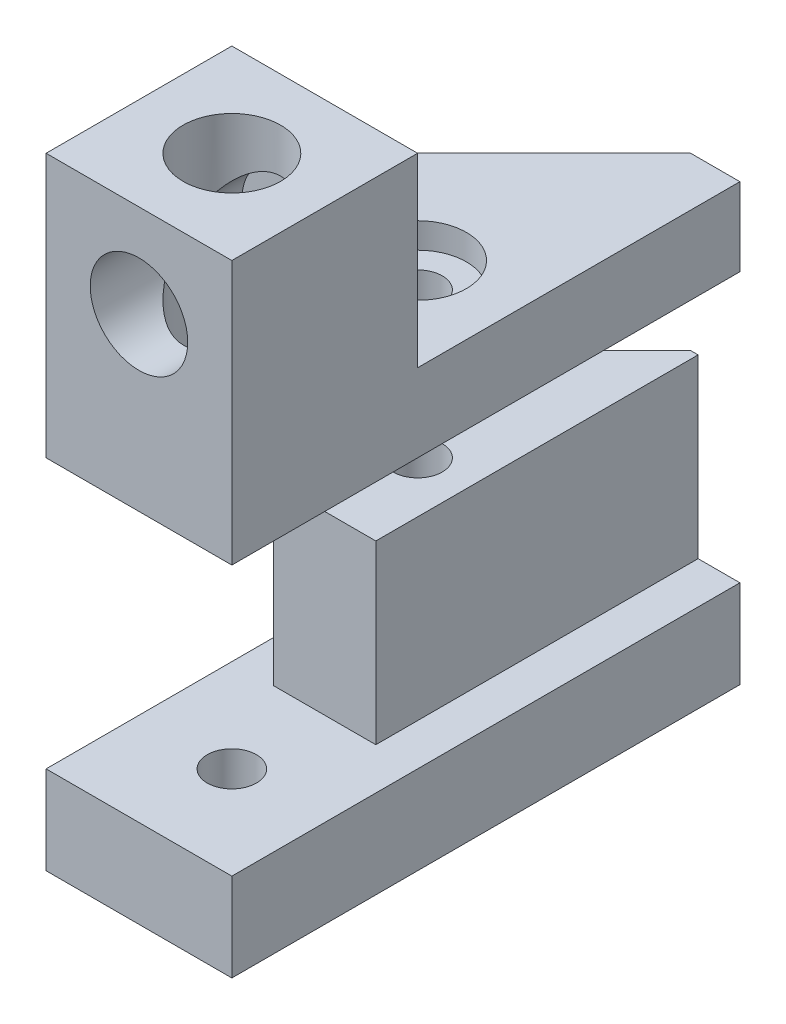
ISO-10303-21;
HEADER;
FILE_DESCRIPTION(('STEP AP214'),'2;1');
FILE_NAME('part.step','',(''),(''),'','','');
FILE_SCHEMA(('AUTOMOTIVE_DESIGN { 1 0 10303 214 1 1 1 1 }'));
ENDSEC;
DATA;
#1=APPLICATION_CONTEXT('core data for automotive mechanical design processes');
#2=APPLICATION_PROTOCOL_DEFINITION('international standard','automotive_design',2000,#1);
#3=PRODUCT_CONTEXT('',#1,'mechanical');
#4=PRODUCT('Part','Part','',(#3));
#5=PRODUCT_RELATED_PRODUCT_CATEGORY('part','',(#4));
#6=PRODUCT_DEFINITION_FORMATION('','',#4);
#7=PRODUCT_DEFINITION_CONTEXT('part definition',#1,'design');
#8=PRODUCT_DEFINITION('design','',#6,#7);
#9=PRODUCT_DEFINITION_SHAPE('','',#8);
#10=(LENGTH_UNIT() NAMED_UNIT(*) SI_UNIT(.MILLI.,.METRE.));
#11=(NAMED_UNIT(*) PLANE_ANGLE_UNIT() SI_UNIT($,.RADIAN.));
#12=(NAMED_UNIT(*) SI_UNIT($,.STERADIAN.) SOLID_ANGLE_UNIT());
#13=UNCERTAINTY_MEASURE_WITH_UNIT(LENGTH_MEASURE(1.E-05),#10,'distance_accuracy_value','');
#14=(GEOMETRIC_REPRESENTATION_CONTEXT(3) GLOBAL_UNCERTAINTY_ASSIGNED_CONTEXT((#13)) GLOBAL_UNIT_ASSIGNED_CONTEXT((#10,
#11,#12)) REPRESENTATION_CONTEXT('',''));
#15=CARTESIAN_POINT('',(0.,0.,0.));
#16=DIRECTION('',(0.,0.,1.));
#17=DIRECTION('',(1.,0.,0.));
#18=AXIS2_PLACEMENT_3D('',#15,#16,#17);
#19=CARTESIAN_POINT('',(0.,46.9,0.));
#20=DIRECTION('',(0.,1.,0.));
#21=DIRECTION('',(0.,0.,1.));
#22=AXIS2_PLACEMENT_3D('',#19,#20,#21);
#23=CYLINDRICAL_SURFACE('',#22,5.25);
#24=CARTESIAN_POINT('',(0.,66.9,0.));
#25=DIRECTION('',(0.,1.,0.));
#26=DIRECTION('',(0.,0.,1.));
#27=AXIS2_PLACEMENT_3D('',#24,#25,#26);
#28=CIRCLE('',#27,5.25);
#29=CARTESIAN_POINT('',(0.,66.9,5.25));
#30=VERTEX_POINT('',#29);
#31=EDGE_CURVE('E166',#30,#30,#28,.T.);
#32=ORIENTED_EDGE('',*,*,#31,.T.);
#33=EDGE_LOOP('',(#32));
#34=FACE_BOUND('',#33,.T.);
#35=CARTESIAN_POINT('',(0.,56.9,0.));
#36=DIRECTION('',(0.,0.707106781186547,-0.707106781186547));
#37=DIRECTION('',(0.,0.707106781186547,0.707106781186547));
#38=AXIS2_PLACEMENT_3D('',#35,#36,#37);
#39=ELLIPSE('',#38,7.42462120245875,5.25);
#40=CARTESIAN_POINT('',(5.25,56.9,0.));
#41=VERTEX_POINT('',#40);
#42=CARTESIAN_POINT('',(-5.25,56.9,0.));
#43=VERTEX_POINT('',#42);
#44=EDGE_CURVE('E12',#41,#43,#39,.F.);
#45=ORIENTED_EDGE('',*,*,#44,.T.);
#46=CARTESIAN_POINT('',(0.,56.9,0.));
#47=DIRECTION('',(0.,0.707106781186547,0.707106781186547));
#48=DIRECTION('',(0.,0.707106781186547,-0.707106781186547));
#49=AXIS2_PLACEMENT_3D('',#46,#47,#48);
#50=ELLIPSE('',#49,7.42462120245875,5.25);
#51=EDGE_CURVE('E64',#43,#41,#50,.F.);
#52=ORIENTED_EDGE('',*,*,#51,.T.);
#53=EDGE_LOOP('',(#45,#52));
#54=FACE_BOUND('',#53,.T.);
#55=ADVANCED_FACE('F55',(#34,#54),#23,.F.);
#56=CARTESIAN_POINT('',(-10.,46.9,-30.));
#57=DIRECTION('',(1.,0.,0.));
#58=DIRECTION('',(0.,0.,-1.));
#59=AXIS2_PLACEMENT_3D('',#56,#57,#58);
#60=PLANE('',#59);
#61=DIRECTION('',(0.,0.,1.));
#62=VECTOR('',#61,1.);
#63=CARTESIAN_POINT('',(-10.,38.5,-30.));
#64=LINE('',#63,#62);
#65=CARTESIAN_POINT('',(-10.,38.5,-30.));
#66=VERTEX_POINT('',#65);
#67=CARTESIAN_POINT('',(-10.,38.5,10.));
#68=VERTEX_POINT('',#67);
#69=EDGE_CURVE('E186',#66,#68,#64,.T.);
#70=ORIENTED_EDGE('',*,*,#69,.T.);
#71=DIRECTION('',(0.,-1.,0.));
#72=VECTOR('',#71,1.);
#73=CARTESIAN_POINT('',(-10.,46.9,10.));
#74=LINE('',#73,#72);
#75=CARTESIAN_POINT('',(-10.,66.9,10.));
#76=VERTEX_POINT('',#75);
#77=EDGE_CURVE('E133',#76,#68,#74,.T.);
#78=ORIENTED_EDGE('',*,*,#77,.F.);
#79=DIRECTION('',(0.,0.,1.));
#80=VECTOR('',#79,1.);
#81=CARTESIAN_POINT('',(-10.,66.9,-10.));
#82=LINE('',#81,#80);
#83=CARTESIAN_POINT('',(-10.,66.9,-10.));
#84=VERTEX_POINT('',#83);
#85=EDGE_CURVE('E169',#84,#76,#82,.T.);
#86=ORIENTED_EDGE('',*,*,#85,.F.);
#87=DIRECTION('',(0.,-1.,0.));
#88=VECTOR('',#87,1.);
#89=CARTESIAN_POINT('',(-10.,66.9,-10.));
#90=LINE('',#89,#88);
#91=CARTESIAN_POINT('',(-10.,46.9,-10.));
#92=VERTEX_POINT('',#91);
#93=EDGE_CURVE('E179',#84,#92,#90,.T.);
#94=ORIENTED_EDGE('',*,*,#93,.T.);
#95=DIRECTION('',(0.,0.,1.));
#96=VECTOR('',#95,1.);
#97=CARTESIAN_POINT('',(-10.,46.9,-30.));
#98=LINE('',#97,#96);
#99=CARTESIAN_POINT('',(-10.,46.9,-30.));
#100=VERTEX_POINT('',#99);
#101=EDGE_CURVE('E187',#100,#92,#98,.T.);
#102=ORIENTED_EDGE('',*,*,#101,.F.);
#103=DIRECTION('',(0.,-1.,0.));
#104=VECTOR('',#103,1.);
#105=CARTESIAN_POINT('',(-10.,46.9,-30.));
#106=LINE('',#105,#104);
#107=EDGE_CURVE('E196',#100,#66,#106,.T.);
#108=ORIENTED_EDGE('',*,*,#107,.T.);
#109=EDGE_LOOP('',(#70,#78,#86,#94,#102,#108));
#110=FACE_BOUND('',#109,.T.);
#111=ADVANCED_FACE('F57',(#110),#60,.F.);
#112=CARTESIAN_POINT('',(-10.,46.9,10.));
#113=DIRECTION('',(0.,0.,-1.));
#114=DIRECTION('',(-1.,0.,0.));
#115=AXIS2_PLACEMENT_3D('',#112,#113,#114);
#116=PLANE('',#115);
#117=CARTESIAN_POINT('',(0.,56.9,10.));
#118=DIRECTION('',(0.,0.,1.));
#119=DIRECTION('',(1.,0.,0.));
#120=AXIS2_PLACEMENT_3D('',#117,#118,#119);
#121=CIRCLE('',#120,5.25);
#122=CARTESIAN_POINT('',(5.25,56.9,10.));
#123=VERTEX_POINT('',#122);
#124=EDGE_CURVE('E142',#123,#123,#121,.T.);
#125=ORIENTED_EDGE('',*,*,#124,.F.);
#126=EDGE_LOOP('',(#125));
#127=FACE_BOUND('',#126,.T.);
#128=DIRECTION('',(1.,0.,0.));
#129=VECTOR('',#128,1.);
#130=CARTESIAN_POINT('',(-10.,38.5,10.));
#131=LINE('',#130,#129);
#132=CARTESIAN_POINT('',(10.,38.5,10.));
#133=VERTEX_POINT('',#132);
#134=EDGE_CURVE('E199',#68,#133,#131,.T.);
#135=ORIENTED_EDGE('',*,*,#134,.T.);
#136=DIRECTION('',(0.,-1.,0.));
#137=VECTOR('',#136,1.);
#138=CARTESIAN_POINT('',(10.,46.9,10.));
#139=LINE('',#138,#137);
#140=CARTESIAN_POINT('',(10.,66.9,10.));
#141=VERTEX_POINT('',#140);
#142=EDGE_CURVE('E136',#141,#133,#139,.T.);
#143=ORIENTED_EDGE('',*,*,#142,.F.);
#144=DIRECTION('',(1.,0.,0.));
#145=VECTOR('',#144,1.);
#146=CARTESIAN_POINT('',(-10.,66.9,10.));
#147=LINE('',#146,#145);
#148=EDGE_CURVE('E172',#76,#141,#147,.T.);
#149=ORIENTED_EDGE('',*,*,#148,.F.);
#150=ORIENTED_EDGE('',*,*,#77,.T.);
#151=EDGE_LOOP('',(#135,#143,#149,#150));
#152=FACE_BOUND('',#151,.T.);
#153=ADVANCED_FACE('F222',(#127,#152),#116,.F.);
#154=CARTESIAN_POINT('',(10.,46.9,-44.7));
#155=DIRECTION('',(-1.,0.,0.));
#156=DIRECTION('',(0.,0.,1.));
#157=AXIS2_PLACEMENT_3D('',#154,#155,#156);
#158=PLANE('',#157);
#159=DIRECTION('',(0.,0.,-1.));
#160=VECTOR('',#159,1.);
#161=CARTESIAN_POINT('',(10.,38.5,-44.7));
#162=LINE('',#161,#160);
#163=CARTESIAN_POINT('',(10.,38.5,-44.7));
#164=VERTEX_POINT('',#163);
#165=EDGE_CURVE('E202',#133,#164,#162,.T.);
#166=ORIENTED_EDGE('',*,*,#165,.T.);
#167=DIRECTION('',(0.,-1.,0.));
#168=VECTOR('',#167,1.);
#169=CARTESIAN_POINT('',(10.,46.9,-44.7));
#170=LINE('',#169,#168);
#171=CARTESIAN_POINT('',(10.,46.9,-44.7));
#172=VERTEX_POINT('',#171);
#173=EDGE_CURVE('E212',#172,#164,#170,.T.);
#174=ORIENTED_EDGE('',*,*,#173,.F.);
#175=DIRECTION('',(0.,0.,-1.));
#176=VECTOR('',#175,1.);
#177=CARTESIAN_POINT('',(10.,46.9,-30.));
#178=LINE('',#177,#176);
#179=CARTESIAN_POINT('',(10.,46.9,-10.));
#180=VERTEX_POINT('',#179);
#181=EDGE_CURVE('E189',#180,#172,#178,.T.);
#182=ORIENTED_EDGE('',*,*,#181,.F.);
#183=DIRECTION('',(0.,-1.,0.));
#184=VECTOR('',#183,1.);
#185=CARTESIAN_POINT('',(10.,66.9,-10.));
#186=LINE('',#185,#184);
#187=CARTESIAN_POINT('',(10.,66.9,-10.));
#188=VERTEX_POINT('',#187);
#189=EDGE_CURVE('E183',#188,#180,#186,.T.);
#190=ORIENTED_EDGE('',*,*,#189,.F.);
#191=DIRECTION('',(0.,0.,-1.));
#192=VECTOR('',#191,1.);
#193=CARTESIAN_POINT('',(10.,66.9,-10.));
#194=LINE('',#193,#192);
#195=EDGE_CURVE('E175',#141,#188,#194,.T.);
#196=ORIENTED_EDGE('',*,*,#195,.F.);
#197=ORIENTED_EDGE('',*,*,#142,.T.);
#198=EDGE_LOOP('',(#166,#174,#182,#190,#196,#197));
#199=FACE_BOUND('',#198,.T.);
#200=ADVANCED_FACE('F217',(#199),#158,.F.);
#201=CARTESIAN_POINT('',(4.7,46.9,-44.7));
#202=DIRECTION('',(0.,0.,1.));
#203=DIRECTION('',(1.,0.,0.));
#204=AXIS2_PLACEMENT_3D('',#201,#202,#203);
#205=PLANE('',#204);
#206=DIRECTION('',(-1.,0.,0.));
#207=VECTOR('',#206,1.);
#208=CARTESIAN_POINT('',(4.7,38.5,-44.7));
#209=LINE('',#208,#207);
#210=CARTESIAN_POINT('',(4.7,38.5,-44.7));
#211=VERTEX_POINT('',#210);
#212=EDGE_CURVE('E204',#164,#211,#209,.T.);
#213=ORIENTED_EDGE('',*,*,#212,.T.);
#214=DIRECTION('',(0.,-1.,0.));
#215=VECTOR('',#214,1.);
#216=CARTESIAN_POINT('',(4.7,46.9,-44.7));
#217=LINE('',#216,#215);
#218=CARTESIAN_POINT('',(4.7,46.9,-44.7));
#219=VERTEX_POINT('',#218);
#220=EDGE_CURVE('E209',#219,#211,#217,.T.);
#221=ORIENTED_EDGE('',*,*,#220,.F.);
#222=DIRECTION('',(-1.,0.,0.));
#223=VECTOR('',#222,1.);
#224=CARTESIAN_POINT('',(4.7,46.9,-44.7));
#225=LINE('',#224,#223);
#226=EDGE_CURVE('E192',#172,#219,#225,.T.);
#227=ORIENTED_EDGE('',*,*,#226,.F.);
#228=ORIENTED_EDGE('',*,*,#173,.T.);
#229=EDGE_LOOP('',(#213,#221,#227,#228));
#230=FACE_BOUND('',#229,.T.);
#231=ADVANCED_FACE('F238',(#230),#205,.F.);
#232=CARTESIAN_POINT('',(-10.,46.9,-30.));
#233=DIRECTION('',(0.707106781186547,0.,0.707106781186548));
#234=DIRECTION('',(0.707106781186548,0.,-0.707106781186547));
#235=AXIS2_PLACEMENT_3D('',#232,#233,#234);
#236=PLANE('',#235);
#237=DIRECTION('',(-0.707106781186548,0.,0.707106781186547));
#238=VECTOR('',#237,1.);
#239=CARTESIAN_POINT('',(-10.,38.5,-30.));
#240=LINE('',#239,#238);
#241=EDGE_CURVE('E190',#211,#66,#240,.T.);
#242=ORIENTED_EDGE('',*,*,#241,.T.);
#243=ORIENTED_EDGE('',*,*,#107,.F.);
#244=DIRECTION('',(-0.707106781186548,0.,0.707106781186547));
#245=VECTOR('',#244,1.);
#246=CARTESIAN_POINT('',(-10.,46.9,-30.));
#247=LINE('',#246,#245);
#248=EDGE_CURVE('E194',#219,#100,#247,.T.);
#249=ORIENTED_EDGE('',*,*,#248,.F.);
#250=ORIENTED_EDGE('',*,*,#220,.T.);
#251=EDGE_LOOP('',(#242,#243,#249,#250));
#252=FACE_BOUND('',#251,.T.);
#253=ADVANCED_FACE('F242',(#252),#236,.F.);
#254=CARTESIAN_POINT('',(0.,46.9,0.));
#255=DIRECTION('',(0.,1.,0.));
#256=DIRECTION('',(0.,0.,1.));
#257=AXIS2_PLACEMENT_3D('',#254,#255,#256);
#258=PLANE('',#257);
#259=CARTESIAN_POINT('',(0.,46.9,-20.));
#260=DIRECTION('',(0.,1.,0.));
#261=DIRECTION('',(0.,0.,1.));
#262=AXIS2_PLACEMENT_3D('',#259,#260,#261);
#263=CIRCLE('',#262,5.24999999999999);
#264=CARTESIAN_POINT('',(0.,46.9,-14.75));
#265=VERTEX_POINT('',#264);
#266=EDGE_CURVE('E158',#265,#265,#263,.T.);
#267=ORIENTED_EDGE('',*,*,#266,.F.);
#268=EDGE_LOOP('',(#267));
#269=FACE_BOUND('',#268,.T.);
#270=DIRECTION('',(-1.,0.,0.));
#271=VECTOR('',#270,1.);
#272=CARTESIAN_POINT('',(-10.,46.9,-10.));
#273=LINE('',#272,#271);
#274=EDGE_CURVE('E79',#180,#92,#273,.T.);
#275=ORIENTED_EDGE('',*,*,#274,.F.);
#276=ORIENTED_EDGE('',*,*,#181,.T.);
#277=ORIENTED_EDGE('',*,*,#226,.T.);
#278=ORIENTED_EDGE('',*,*,#248,.T.);
#279=ORIENTED_EDGE('',*,*,#101,.T.);
#280=EDGE_LOOP('',(#275,#276,#277,#278,#279));
#281=FACE_BOUND('',#280,.T.);
#282=ADVANCED_FACE('F243',(#269,#281),#258,.T.);
#283=CARTESIAN_POINT('',(0.,38.5,0.));
#284=DIRECTION('',(0.,1.,0.));
#285=DIRECTION('',(0.,0.,1.));
#286=AXIS2_PLACEMENT_3D('',#283,#284,#285);
#287=PLANE('',#286);
#288=CARTESIAN_POINT('',(0.,38.5,-20.));
#289=DIRECTION('',(0.,1.,0.));
#290=DIRECTION('',(0.,0.,1.));
#291=AXIS2_PLACEMENT_3D('',#288,#289,#290);
#292=CIRCLE('',#291,2.65);
#293=CARTESIAN_POINT('',(0.,38.5,-17.35));
#294=VERTEX_POINT('',#293);
#295=EDGE_CURVE('E144',#294,#294,#292,.T.);
#296=ORIENTED_EDGE('',*,*,#295,.T.);
#297=EDGE_LOOP('',(#296));
#298=FACE_BOUND('',#297,.T.);
#299=CARTESIAN_POINT('',(0.,38.5,0.));
#300=DIRECTION('',(0.,1.,0.));
#301=DIRECTION('',(0.,0.,1.));
#302=AXIS2_PLACEMENT_3D('',#299,#300,#301);
#303=CIRCLE('',#302,2.65);
#304=CARTESIAN_POINT('',(0.,38.5,2.65));
#305=VERTEX_POINT('',#304);
#306=EDGE_CURVE('E140',#305,#305,#303,.T.);
#307=ORIENTED_EDGE('',*,*,#306,.T.);
#308=EDGE_LOOP('',(#307));
#309=FACE_BOUND('',#308,.T.);
#310=ORIENTED_EDGE('',*,*,#69,.F.);
#311=ORIENTED_EDGE('',*,*,#241,.F.);
#312=ORIENTED_EDGE('',*,*,#212,.F.);
#313=ORIENTED_EDGE('',*,*,#165,.F.);
#314=ORIENTED_EDGE('',*,*,#134,.F.);
#315=EDGE_LOOP('',(#310,#311,#312,#313,#314));
#316=FACE_BOUND('',#315,.T.);
#317=ADVANCED_FACE('F234',(#298,#309,#316),#287,.F.);
#318=CARTESIAN_POINT('',(-10.,66.9,-10.));
#319=DIRECTION('',(0.,0.,1.));
#320=DIRECTION('',(1.,0.,0.));
#321=AXIS2_PLACEMENT_3D('',#318,#319,#320);
#322=PLANE('',#321);
#323=CARTESIAN_POINT('',(0.,56.9,-10.));
#324=DIRECTION('',(0.,0.,1.));
#325=DIRECTION('',(1.,0.,0.));
#326=AXIS2_PLACEMENT_3D('',#323,#324,#325);
#327=CIRCLE('',#326,2.65);
#328=CARTESIAN_POINT('',(2.65,56.9,-10.));
#329=VERTEX_POINT('',#328);
#330=EDGE_CURVE('E59',#329,#329,#327,.T.);
#331=ORIENTED_EDGE('',*,*,#330,.T.);
#332=EDGE_LOOP('',(#331));
#333=FACE_BOUND('',#332,.T.);
#334=ORIENTED_EDGE('',*,*,#274,.T.);
#335=ORIENTED_EDGE('',*,*,#93,.F.);
#336=DIRECTION('',(-1.,0.,0.));
#337=VECTOR('',#336,1.);
#338=CARTESIAN_POINT('',(-10.,66.9,-10.));
#339=LINE('',#338,#337);
#340=EDGE_CURVE('E177',#188,#84,#339,.T.);
#341=ORIENTED_EDGE('',*,*,#340,.F.);
#342=ORIENTED_EDGE('',*,*,#189,.T.);
#343=EDGE_LOOP('',(#334,#335,#341,#342));
#344=FACE_BOUND('',#343,.T.);
#345=ADVANCED_FACE('F245',(#333,#344),#322,.F.);
#346=CARTESIAN_POINT('',(0.,66.9,0.));
#347=DIRECTION('',(0.,1.,0.));
#348=DIRECTION('',(0.,0.,1.));
#349=AXIS2_PLACEMENT_3D('',#346,#347,#348);
#350=PLANE('',#349);
#351=ORIENTED_EDGE('',*,*,#31,.F.);
#352=EDGE_LOOP('',(#351));
#353=FACE_BOUND('',#352,.T.);
#354=ORIENTED_EDGE('',*,*,#85,.T.);
#355=ORIENTED_EDGE('',*,*,#148,.T.);
#356=ORIENTED_EDGE('',*,*,#195,.T.);
#357=ORIENTED_EDGE('',*,*,#340,.T.);
#358=EDGE_LOOP('',(#354,#355,#356,#357));
#359=FACE_BOUND('',#358,.T.);
#360=ADVANCED_FACE('F224',(#353,#359),#350,.T.);
#361=CARTESIAN_POINT('',(0.,56.9,0.));
#362=DIRECTION('',(0.,0.707106781186547,0.707106781186547));
#363=DIRECTION('',(0.,0.707106781186547,-0.707106781186547));
#364=AXIS2_PLACEMENT_3D('',#361,#362,#363);
#365=ELLIPSE('',#364,7.42462120245875,5.25);
#366=EDGE_CURVE('E125',#43,#41,#365,.T.);
#367=ORIENTED_EDGE('',*,*,#366,.T.);
#368=CARTESIAN_POINT('',(0.,56.9,0.));
#369=DIRECTION('',(0.,0.707106781186547,-0.707106781186547));
#370=DIRECTION('',(0.,0.707106781186547,0.707106781186547));
#371=AXIS2_PLACEMENT_3D('',#368,#369,#370);
#372=ELLIPSE('',#371,7.42462120245875,5.25);
#373=EDGE_CURVE('E71',#41,#43,#372,.T.);
#374=ORIENTED_EDGE('',*,*,#373,.T.);
#375=EDGE_LOOP('',(#367,#374));
#376=FACE_BOUND('',#375,.T.);
#377=CARTESIAN_POINT('',(0.,44.15,0.));
#378=DIRECTION('',(0.,1.,0.));
#379=DIRECTION('',(0.,0.,1.));
#380=AXIS2_PLACEMENT_3D('',#377,#378,#379);
#381=CIRCLE('',#380,5.24999999999999);
#382=CARTESIAN_POINT('',(0.,44.15,5.24999999999999));
#383=VERTEX_POINT('',#382);
#384=EDGE_CURVE('E146',#383,#383,#381,.T.);
#385=ORIENTED_EDGE('',*,*,#384,.F.);
#386=EDGE_LOOP('',(#385));
#387=FACE_BOUND('',#386,.T.);
#388=ADVANCED_FACE('F131',(#376,#387),#23,.F.);
#389=CARTESIAN_POINT('',(0.,56.9,-3.6));
#390=DIRECTION('',(0.,0.,1.));
#391=DIRECTION('',(1.,0.,0.));
#392=AXIS2_PLACEMENT_3D('',#389,#390,#391);
#393=CYLINDRICAL_SURFACE('',#392,5.25);
#394=ORIENTED_EDGE('',*,*,#373,.F.);
#395=ORIENTED_EDGE('',*,*,#51,.F.);
#396=EDGE_LOOP('',(#394,#395));
#397=FACE_BOUND('',#396,.T.);
#398=CARTESIAN_POINT('',(0.,56.9,-6.35));
#399=DIRECTION('',(0.,0.,1.));
#400=DIRECTION('',(1.,0.,0.));
#401=AXIS2_PLACEMENT_3D('',#398,#399,#400);
#402=CIRCLE('',#401,5.24999999999999);
#403=CARTESIAN_POINT('',(5.24999999999999,56.9,-6.35));
#404=VERTEX_POINT('',#403);
#405=EDGE_CURVE('E311',#404,#404,#402,.T.);
#406=ORIENTED_EDGE('',*,*,#405,.F.);
#407=EDGE_LOOP('',(#406));
#408=FACE_BOUND('',#407,.T.);
#409=ADVANCED_FACE('F121',(#397,#408),#393,.F.);
#410=ORIENTED_EDGE('',*,*,#124,.T.);
#411=EDGE_LOOP('',(#410));
#412=FACE_BOUND('',#411,.T.);
#413=ORIENTED_EDGE('',*,*,#44,.F.);
#414=ORIENTED_EDGE('',*,*,#366,.F.);
#415=EDGE_LOOP('',(#413,#414));
#416=FACE_BOUND('',#415,.T.);
#417=ADVANCED_FACE('F128',(#412,#416),#393,.F.);
#418=CARTESIAN_POINT('',(0.,46.9,0.));
#419=DIRECTION('',(0.,1.,0.));
#420=DIRECTION('',(0.,0.,1.));
#421=AXIS2_PLACEMENT_3D('',#418,#419,#420);
#422=CYLINDRICAL_SURFACE('',#421,2.65);
#423=CARTESIAN_POINT('',(0.,44.15,0.));
#424=DIRECTION('',(0.,1.,0.));
#425=DIRECTION('',(0.,0.,1.));
#426=AXIS2_PLACEMENT_3D('',#423,#424,#425);
#427=CIRCLE('',#426,2.65000000000001);
#428=CARTESIAN_POINT('',(0.,44.15,2.65000000000001));
#429=VERTEX_POINT('',#428);
#430=EDGE_CURVE('E143',#429,#429,#427,.T.);
#431=ORIENTED_EDGE('',*,*,#430,.T.);
#432=EDGE_LOOP('',(#431));
#433=FACE_BOUND('',#432,.T.);
#434=ORIENTED_EDGE('',*,*,#306,.F.);
#435=EDGE_LOOP('',(#434));
#436=FACE_BOUND('',#435,.T.);
#437=ADVANCED_FACE('F274',(#433,#436),#422,.F.);
#438=CARTESIAN_POINT('',(2.65000000000001,44.15,0.));
#439=DIRECTION('',(0.,-1.,0.));
#440=DIRECTION('',(0.,0.,-1.));
#441=AXIS2_PLACEMENT_3D('',#438,#439,#440);
#442=PLANE('',#441);
#443=ORIENTED_EDGE('',*,*,#430,.F.);
#444=EDGE_LOOP('',(#443));
#445=FACE_BOUND('',#444,.T.);
#446=ORIENTED_EDGE('',*,*,#384,.T.);
#447=EDGE_LOOP('',(#446));
#448=FACE_BOUND('',#447,.T.);
#449=ADVANCED_FACE('F279',(#445,#448),#442,.F.);
#450=CARTESIAN_POINT('',(0.,46.9,-20.));
#451=DIRECTION('',(0.,1.,0.));
#452=DIRECTION('',(0.,0.,1.));
#453=AXIS2_PLACEMENT_3D('',#450,#451,#452);
#454=CYLINDRICAL_SURFACE('',#453,2.65);
#455=CARTESIAN_POINT('',(0.,44.15,-20.));
#456=DIRECTION('',(0.,1.,0.));
#457=DIRECTION('',(0.,0.,1.));
#458=AXIS2_PLACEMENT_3D('',#455,#456,#457);
#459=CIRCLE('',#458,2.65000000000001);
#460=CARTESIAN_POINT('',(0.,44.15,-17.35));
#461=VERTEX_POINT('',#460);
#462=EDGE_CURVE('E147',#461,#461,#459,.T.);
#463=ORIENTED_EDGE('',*,*,#462,.T.);
#464=EDGE_LOOP('',(#463));
#465=FACE_BOUND('',#464,.T.);
#466=ORIENTED_EDGE('',*,*,#295,.F.);
#467=EDGE_LOOP('',(#466));
#468=FACE_BOUND('',#467,.T.);
#469=ADVANCED_FACE('F283',(#465,#468),#454,.F.);
#470=CARTESIAN_POINT('',(2.65000000000001,44.15,-20.));
#471=DIRECTION('',(0.,-1.,0.));
#472=DIRECTION('',(0.,0.,-1.));
#473=AXIS2_PLACEMENT_3D('',#470,#471,#472);
#474=PLANE('',#473);
#475=ORIENTED_EDGE('',*,*,#462,.F.);
#476=EDGE_LOOP('',(#475));
#477=FACE_BOUND('',#476,.T.);
#478=CARTESIAN_POINT('',(0.,44.15,-20.));
#479=DIRECTION('',(0.,1.,0.));
#480=DIRECTION('',(0.,0.,1.));
#481=AXIS2_PLACEMENT_3D('',#478,#479,#480);
#482=CIRCLE('',#481,5.24999999999999);
#483=CARTESIAN_POINT('',(0.,44.15,-14.75));
#484=VERTEX_POINT('',#483);
#485=EDGE_CURVE('E153',#484,#484,#482,.T.);
#486=ORIENTED_EDGE('',*,*,#485,.T.);
#487=EDGE_LOOP('',(#486));
#488=FACE_BOUND('',#487,.T.);
#489=ADVANCED_FACE('F287',(#477,#488),#474,.F.);
#490=CARTESIAN_POINT('',(0.,46.9,-20.));
#491=DIRECTION('',(0.,1.,0.));
#492=DIRECTION('',(0.,0.,1.));
#493=AXIS2_PLACEMENT_3D('',#490,#491,#492);
#494=CYLINDRICAL_SURFACE('',#493,5.24999999999999);
#495=ORIENTED_EDGE('',*,*,#485,.F.);
#496=EDGE_LOOP('',(#495));
#497=FACE_BOUND('',#496,.T.);
#498=ORIENTED_EDGE('',*,*,#266,.T.);
#499=EDGE_LOOP('',(#498));
#500=FACE_BOUND('',#499,.T.);
#501=ADVANCED_FACE('F290',(#497,#500),#494,.F.);
#502=CARTESIAN_POINT('',(0.,56.9,-3.6));
#503=DIRECTION('',(0.,0.,1.));
#504=DIRECTION('',(1.,0.,0.));
#505=AXIS2_PLACEMENT_3D('',#502,#503,#504);
#506=CYLINDRICAL_SURFACE('',#505,2.65);
#507=CARTESIAN_POINT('',(0.,56.9,-6.35));
#508=DIRECTION('',(0.,0.,1.));
#509=DIRECTION('',(1.,0.,0.));
#510=AXIS2_PLACEMENT_3D('',#507,#508,#509);
#511=CIRCLE('',#510,2.65000000000001);
#512=CARTESIAN_POINT('',(2.65000000000001,56.9,-6.35));
#513=VERTEX_POINT('',#512);
#514=EDGE_CURVE('E308',#513,#513,#511,.T.);
#515=ORIENTED_EDGE('',*,*,#514,.T.);
#516=EDGE_LOOP('',(#515));
#517=FACE_BOUND('',#516,.T.);
#518=ORIENTED_EDGE('',*,*,#330,.F.);
#519=EDGE_LOOP('',(#518));
#520=FACE_BOUND('',#519,.T.);
#521=ADVANCED_FACE('F294',(#517,#520),#506,.F.);
#522=CARTESIAN_POINT('',(2.65000000000001,56.9,-6.35));
#523=DIRECTION('',(0.,0.,-1.));
#524=DIRECTION('',(-1.,0.,0.));
#525=AXIS2_PLACEMENT_3D('',#522,#523,#524);
#526=PLANE('',#525);
#527=ORIENTED_EDGE('',*,*,#514,.F.);
#528=EDGE_LOOP('',(#527));
#529=FACE_BOUND('',#528,.T.);
#530=ORIENTED_EDGE('',*,*,#405,.T.);
#531=EDGE_LOOP('',(#530));
#532=FACE_BOUND('',#531,.T.);
#533=ADVANCED_FACE('F298',(#529,#532),#526,.F.);
#534=CLOSED_SHELL('',(#55,#111,#153,#200,#231,#253,#282,#317,#345,#360,#388,#409,#417,#437,#449,
#469,#489,#501,#521,#533));
#535=MANIFOLD_SOLID_BREP('B2',#534);
#536=CARTESIAN_POINT('',(10.,9.5,-44.7));
#537=DIRECTION('',(-1.,0.,0.));
#538=DIRECTION('',(0.,0.,1.));
#539=AXIS2_PLACEMENT_3D('',#536,#537,#538);
#540=PLANE('',#539);
#541=DIRECTION('',(0.,0.,-1.));
#542=VECTOR('',#541,1.);
#543=CARTESIAN_POINT('',(10.,0.,-44.7));
#544=LINE('',#543,#542);
#545=CARTESIAN_POINT('',(10.,0.,10.));
#546=VERTEX_POINT('',#545);
#547=CARTESIAN_POINT('',(10.,0.,-44.7));
#548=VERTEX_POINT('',#547);
#549=EDGE_CURVE('E560',#546,#548,#544,.T.);
#550=ORIENTED_EDGE('',*,*,#549,.T.);
#551=DIRECTION('',(0.,-1.,0.));
#552=VECTOR('',#551,1.);
#553=CARTESIAN_POINT('',(10.,9.5,-44.7));
#554=LINE('',#553,#552);
#555=CARTESIAN_POINT('',(10.,9.5,-44.7));
#556=VERTEX_POINT('',#555);
#557=EDGE_CURVE('E53',#556,#548,#554,.T.);
#558=ORIENTED_EDGE('',*,*,#557,.F.);
#559=DIRECTION('',(0.,0.,-1.));
#560=VECTOR('',#559,1.);
#561=CARTESIAN_POINT('',(10.,9.5,10.));
#562=LINE('',#561,#560);
#563=CARTESIAN_POINT('',(10.,9.5,10.));
#564=VERTEX_POINT('',#563);
#565=EDGE_CURVE('E585',#564,#556,#562,.T.);
#566=ORIENTED_EDGE('',*,*,#565,.F.);
#567=DIRECTION('',(0.,-1.,0.));
#568=VECTOR('',#567,1.);
#569=CARTESIAN_POINT('',(10.,9.5,10.));
#570=LINE('',#569,#568);
#571=EDGE_CURVE('E596',#564,#546,#570,.T.);
#572=ORIENTED_EDGE('',*,*,#571,.T.);
#573=EDGE_LOOP('',(#550,#558,#566,#572));
#574=FACE_BOUND('',#573,.T.);
#575=ADVANCED_FACE('F474',(#574),#540,.F.);
#576=CARTESIAN_POINT('',(10.,9.5,-44.7));
#577=DIRECTION('',(0.,0.,1.));
#578=DIRECTION('',(1.,0.,0.));
#579=AXIS2_PLACEMENT_3D('',#576,#577,#578);
#580=PLANE('',#579);
#581=DIRECTION('',(-1.,0.,0.));
#582=VECTOR('',#581,1.);
#583=CARTESIAN_POINT('',(10.,0.,-44.7));
#584=LINE('',#583,#582);
#585=CARTESIAN_POINT('',(4.7,0.,-44.7));
#586=VERTEX_POINT('',#585);
#587=EDGE_CURVE('E598',#548,#586,#584,.T.);
#588=ORIENTED_EDGE('',*,*,#587,.T.);
#589=DIRECTION('',(0.,-1.,0.));
#590=VECTOR('',#589,1.);
#591=CARTESIAN_POINT('',(4.7,9.5,-44.7));
#592=LINE('',#591,#590);
#593=CARTESIAN_POINT('',(4.7,28.5,-44.7));
#594=VERTEX_POINT('',#593);
#595=EDGE_CURVE('E482',#594,#586,#592,.T.);
#596=ORIENTED_EDGE('',*,*,#595,.F.);
#597=DIRECTION('',(-1.,0.,0.));
#598=VECTOR('',#597,1.);
#599=CARTESIAN_POINT('',(4.7,28.5,-44.7));
#600=LINE('',#599,#598);
#601=CARTESIAN_POINT('',(5.5,28.5,-44.7));
#602=VERTEX_POINT('',#601);
#603=EDGE_CURVE('E568',#602,#594,#600,.T.);
#604=ORIENTED_EDGE('',*,*,#603,.F.);
#605=DIRECTION('',(0.,-1.,0.));
#606=VECTOR('',#605,1.);
#607=CARTESIAN_POINT('',(5.5,28.5,-44.7));
#608=LINE('',#607,#606);
#609=CARTESIAN_POINT('',(5.5,9.5,-44.7));
#610=VERTEX_POINT('',#609);
#611=EDGE_CURVE('E581',#602,#610,#608,.T.);
#612=ORIENTED_EDGE('',*,*,#611,.T.);
#613=DIRECTION('',(-1.,0.,0.));
#614=VECTOR('',#613,1.);
#615=CARTESIAN_POINT('',(10.,9.5,-44.7));
#616=LINE('',#615,#614);
#617=EDGE_CURVE('E587',#556,#610,#616,.T.);
#618=ORIENTED_EDGE('',*,*,#617,.F.);
#619=ORIENTED_EDGE('',*,*,#557,.T.);
#620=EDGE_LOOP('',(#588,#596,#604,#612,#618,#619));
#621=FACE_BOUND('',#620,.T.);
#622=ADVANCED_FACE('F639',(#621),#580,.F.);
#623=CARTESIAN_POINT('',(-10.,9.5,-30.));
#624=DIRECTION('',(0.707106781186547,0.,0.707106781186548));
#625=DIRECTION('',(0.707106781186548,0.,-0.707106781186547));
#626=AXIS2_PLACEMENT_3D('',#623,#624,#625);
#627=PLANE('',#626);
#628=DIRECTION('',(-0.707106781186548,0.,0.707106781186547));
#629=VECTOR('',#628,1.);
#630=CARTESIAN_POINT('',(-10.,0.,-30.));
#631=LINE('',#630,#629);
#632=CARTESIAN_POINT('',(-10.,0.,-30.));
#633=VERTEX_POINT('',#632);
#634=EDGE_CURVE('E600',#586,#633,#631,.T.);
#635=ORIENTED_EDGE('',*,*,#634,.T.);
#636=DIRECTION('',(0.,-1.,0.));
#637=VECTOR('',#636,1.);
#638=CARTESIAN_POINT('',(-10.,9.5,-30.));
#639=LINE('',#638,#637);
#640=CARTESIAN_POINT('',(-10.,9.5,-30.));
#641=VERTEX_POINT('',#640);
#642=EDGE_CURVE('E611',#641,#633,#639,.T.);
#643=ORIENTED_EDGE('',*,*,#642,.F.);
#644=DIRECTION('',(-0.707106781186548,0.,0.707106781186547));
#645=VECTOR('',#644,1.);
#646=CARTESIAN_POINT('',(-10.,9.5,-30.));
#647=LINE('',#646,#645);
#648=CARTESIAN_POINT('',(-5.5,9.5,-34.5));
#649=VERTEX_POINT('',#648);
#650=EDGE_CURVE('E590',#649,#641,#647,.T.);
#651=ORIENTED_EDGE('',*,*,#650,.F.);
#652=DIRECTION('',(0.,-1.,0.));
#653=VECTOR('',#652,1.);
#654=CARTESIAN_POINT('',(-5.5,28.5,-34.5));
#655=LINE('',#654,#653);
#656=CARTESIAN_POINT('',(-5.5,28.5,-34.5));
#657=VERTEX_POINT('',#656);
#658=EDGE_CURVE('E574',#657,#649,#655,.T.);
#659=ORIENTED_EDGE('',*,*,#658,.F.);
#660=DIRECTION('',(-0.707106781186548,0.,0.707106781186547));
#661=VECTOR('',#660,1.);
#662=CARTESIAN_POINT('',(-5.5,28.5,-34.5));
#663=LINE('',#662,#661);
#664=EDGE_CURVE('E550',#594,#657,#663,.T.);
#665=ORIENTED_EDGE('',*,*,#664,.F.);
#666=ORIENTED_EDGE('',*,*,#595,.T.);
#667=EDGE_LOOP('',(#635,#643,#651,#659,#665,#666));
#668=FACE_BOUND('',#667,.T.);
#669=ADVANCED_FACE('F617',(#668),#627,.F.);
#670=CARTESIAN_POINT('',(-10.,9.5,10.));
#671=DIRECTION('',(1.,0.,0.));
#672=DIRECTION('',(0.,0.,-1.));
#673=AXIS2_PLACEMENT_3D('',#670,#671,#672);
#674=PLANE('',#673);
#675=DIRECTION('',(0.,0.,1.));
#676=VECTOR('',#675,1.);
#677=CARTESIAN_POINT('',(-10.,0.,10.));
#678=LINE('',#677,#676);
#679=CARTESIAN_POINT('',(-10.,0.,10.));
#680=VERTEX_POINT('',#679);
#681=EDGE_CURVE('E602',#633,#680,#678,.T.);
#682=ORIENTED_EDGE('',*,*,#681,.T.);
#683=DIRECTION('',(0.,-1.,0.));
#684=VECTOR('',#683,1.);
#685=CARTESIAN_POINT('',(-10.,9.5,10.));
#686=LINE('',#685,#684);
#687=CARTESIAN_POINT('',(-10.,9.5,10.));
#688=VERTEX_POINT('',#687);
#689=EDGE_CURVE('E608',#688,#680,#686,.T.);
#690=ORIENTED_EDGE('',*,*,#689,.F.);
#691=DIRECTION('',(0.,0.,1.));
#692=VECTOR('',#691,1.);
#693=CARTESIAN_POINT('',(-10.,9.5,10.));
#694=LINE('',#693,#692);
#695=EDGE_CURVE('E592',#641,#688,#694,.T.);
#696=ORIENTED_EDGE('',*,*,#695,.F.);
#697=ORIENTED_EDGE('',*,*,#642,.T.);
#698=EDGE_LOOP('',(#682,#690,#696,#697));
#699=FACE_BOUND('',#698,.T.);
#700=ADVANCED_FACE('F628',(#699),#674,.F.);
#701=CARTESIAN_POINT('',(10.,9.5,10.));
#702=DIRECTION('',(0.,0.,-1.));
#703=DIRECTION('',(-1.,0.,0.));
#704=AXIS2_PLACEMENT_3D('',#701,#702,#703);
#705=PLANE('',#704);
#706=DIRECTION('',(1.,0.,0.));
#707=VECTOR('',#706,1.);
#708=CARTESIAN_POINT('',(10.,0.,10.));
#709=LINE('',#708,#707);
#710=EDGE_CURVE('E588',#680,#546,#709,.T.);
#711=ORIENTED_EDGE('',*,*,#710,.T.);
#712=ORIENTED_EDGE('',*,*,#571,.F.);
#713=DIRECTION('',(1.,0.,0.));
#714=VECTOR('',#713,1.);
#715=CARTESIAN_POINT('',(10.,9.5,10.));
#716=LINE('',#715,#714);
#717=EDGE_CURVE('E594',#688,#564,#716,.T.);
#718=ORIENTED_EDGE('',*,*,#717,.F.);
#719=ORIENTED_EDGE('',*,*,#689,.T.);
#720=EDGE_LOOP('',(#711,#712,#718,#719));
#721=FACE_BOUND('',#720,.T.);
#722=ADVANCED_FACE('F632',(#721),#705,.F.);
#723=CARTESIAN_POINT('',(0.,9.5,0.));
#724=DIRECTION('',(0.,1.,0.));
#725=DIRECTION('',(0.,0.,1.));
#726=AXIS2_PLACEMENT_3D('',#723,#724,#725);
#727=PLANE('',#726);
#728=CARTESIAN_POINT('',(0.,9.5,0.));
#729=DIRECTION('',(0.,1.,0.));
#730=DIRECTION('',(0.,0.,1.));
#731=AXIS2_PLACEMENT_3D('',#728,#729,#730);
#732=CIRCLE('',#731,2.65);
#733=CARTESIAN_POINT('',(0.,9.5,2.65));
#734=VERTEX_POINT('',#733);
#735=EDGE_CURVE('E576',#734,#734,#732,.T.);
#736=ORIENTED_EDGE('',*,*,#735,.F.);
#737=EDGE_LOOP('',(#736));
#738=FACE_BOUND('',#737,.T.);
#739=DIRECTION('',(0.,0.,1.));
#740=VECTOR('',#739,1.);
#741=CARTESIAN_POINT('',(-5.5,9.5,-30.));
#742=LINE('',#741,#740);
#743=CARTESIAN_POINT('',(-5.5,9.5,-10.));
#744=VERTEX_POINT('',#743);
#745=EDGE_CURVE('E493',#649,#744,#742,.T.);
#746=ORIENTED_EDGE('',*,*,#745,.F.);
#747=ORIENTED_EDGE('',*,*,#650,.T.);
#748=ORIENTED_EDGE('',*,*,#695,.T.);
#749=ORIENTED_EDGE('',*,*,#717,.T.);
#750=ORIENTED_EDGE('',*,*,#565,.T.);
#751=ORIENTED_EDGE('',*,*,#617,.T.);
#752=DIRECTION('',(0.,0.,-1.));
#753=VECTOR('',#752,1.);
#754=CARTESIAN_POINT('',(5.5,9.5,-44.7));
#755=LINE('',#754,#753);
#756=CARTESIAN_POINT('',(5.5,9.5,-10.));
#757=VERTEX_POINT('',#756);
#758=EDGE_CURVE('E554',#757,#610,#755,.T.);
#759=ORIENTED_EDGE('',*,*,#758,.F.);
#760=DIRECTION('',(1.,0.,0.));
#761=VECTOR('',#760,1.);
#762=CARTESIAN_POINT('',(-5.5,9.5,-10.));
#763=LINE('',#762,#761);
#764=EDGE_CURVE('E489',#744,#757,#763,.T.);
#765=ORIENTED_EDGE('',*,*,#764,.F.);
#766=EDGE_LOOP('',(#746,#747,#748,#749,#750,#751,#759,#765));
#767=FACE_BOUND('',#766,.T.);
#768=ADVANCED_FACE('F635',(#738,#767),#727,.T.);
#769=CARTESIAN_POINT('',(0.,0.,0.));
#770=DIRECTION('',(0.,1.,0.));
#771=DIRECTION('',(0.,0.,1.));
#772=AXIS2_PLACEMENT_3D('',#769,#770,#771);
#773=PLANE('',#772);
#774=CARTESIAN_POINT('',(0.,0.,-20.));
#775=DIRECTION('',(0.,1.,0.));
#776=DIRECTION('',(0.,0.,1.));
#777=AXIS2_PLACEMENT_3D('',#774,#775,#776);
#778=CIRCLE('',#777,2.64999999999999);
#779=CARTESIAN_POINT('',(0.,0.,-17.35));
#780=VERTEX_POINT('',#779);
#781=EDGE_CURVE('E770',#780,#780,#778,.T.);
#782=ORIENTED_EDGE('',*,*,#781,.T.);
#783=EDGE_LOOP('',(#782));
#784=FACE_BOUND('',#783,.T.);
#785=CARTESIAN_POINT('',(0.,0.,0.));
#786=DIRECTION('',(0.,1.,0.));
#787=DIRECTION('',(0.,0.,1.));
#788=AXIS2_PLACEMENT_3D('',#785,#786,#787);
#789=CIRCLE('',#788,2.64999999999999);
#790=CARTESIAN_POINT('',(0.,0.,2.64999999999999));
#791=VERTEX_POINT('',#790);
#792=EDGE_CURVE('E773',#791,#791,#789,.T.);
#793=ORIENTED_EDGE('',*,*,#792,.T.);
#794=EDGE_LOOP('',(#793));
#795=FACE_BOUND('',#794,.T.);
#796=ORIENTED_EDGE('',*,*,#549,.F.);
#797=ORIENTED_EDGE('',*,*,#710,.F.);
#798=ORIENTED_EDGE('',*,*,#681,.F.);
#799=ORIENTED_EDGE('',*,*,#634,.F.);
#800=ORIENTED_EDGE('',*,*,#587,.F.);
#801=EDGE_LOOP('',(#796,#797,#798,#799,#800));
#802=FACE_BOUND('',#801,.T.);
#803=ADVANCED_FACE('F624',(#784,#795,#802),#773,.F.);
#804=CARTESIAN_POINT('',(-5.5,28.5,-30.));
#805=DIRECTION('',(1.,0.,0.));
#806=DIRECTION('',(0.,0.,-1.));
#807=AXIS2_PLACEMENT_3D('',#804,#805,#806);
#808=PLANE('',#807);
#809=ORIENTED_EDGE('',*,*,#745,.T.);
#810=DIRECTION('',(0.,-1.,0.));
#811=VECTOR('',#810,1.);
#812=CARTESIAN_POINT('',(-5.5,28.5,-10.));
#813=LINE('',#812,#811);
#814=CARTESIAN_POINT('',(-5.5,28.5,-10.));
#815=VERTEX_POINT('',#814);
#816=EDGE_CURVE('E557',#815,#744,#813,.T.);
#817=ORIENTED_EDGE('',*,*,#816,.F.);
#818=DIRECTION('',(0.,0.,1.));
#819=VECTOR('',#818,1.);
#820=CARTESIAN_POINT('',(-5.5,28.5,-30.));
#821=LINE('',#820,#819);
#822=EDGE_CURVE('E542',#657,#815,#821,.T.);
#823=ORIENTED_EDGE('',*,*,#822,.F.);
#824=ORIENTED_EDGE('',*,*,#658,.T.);
#825=EDGE_LOOP('',(#809,#817,#823,#824));
#826=FACE_BOUND('',#825,.T.);
#827=ADVANCED_FACE('F558',(#826),#808,.F.);
#828=CARTESIAN_POINT('',(-5.5,28.5,-10.));
#829=DIRECTION('',(0.,0.,-1.));
#830=DIRECTION('',(-1.,0.,0.));
#831=AXIS2_PLACEMENT_3D('',#828,#829,#830);
#832=PLANE('',#831);
#833=ORIENTED_EDGE('',*,*,#764,.T.);
#834=DIRECTION('',(0.,-1.,0.));
#835=VECTOR('',#834,1.);
#836=CARTESIAN_POINT('',(5.5,28.5,-10.));
#837=LINE('',#836,#835);
#838=CARTESIAN_POINT('',(5.5,28.5,-10.));
#839=VERTEX_POINT('',#838);
#840=EDGE_CURVE('E561',#839,#757,#837,.T.);
#841=ORIENTED_EDGE('',*,*,#840,.F.);
#842=DIRECTION('',(1.,0.,0.));
#843=VECTOR('',#842,1.);
#844=CARTESIAN_POINT('',(-5.5,28.5,-10.));
#845=LINE('',#844,#843);
#846=EDGE_CURVE('E546',#815,#839,#845,.T.);
#847=ORIENTED_EDGE('',*,*,#846,.F.);
#848=ORIENTED_EDGE('',*,*,#816,.T.);
#849=EDGE_LOOP('',(#833,#841,#847,#848));
#850=FACE_BOUND('',#849,.T.);
#851=ADVANCED_FACE('F563',(#850),#832,.F.);
#852=CARTESIAN_POINT('',(5.5,28.5,-44.7));
#853=DIRECTION('',(-1.,0.,0.));
#854=DIRECTION('',(0.,0.,1.));
#855=AXIS2_PLACEMENT_3D('',#852,#853,#854);
#856=PLANE('',#855);
#857=ORIENTED_EDGE('',*,*,#758,.T.);
#858=ORIENTED_EDGE('',*,*,#611,.F.);
#859=DIRECTION('',(0.,0.,-1.));
#860=VECTOR('',#859,1.);
#861=CARTESIAN_POINT('',(5.5,28.5,-30.));
#862=LINE('',#861,#860);
#863=EDGE_CURVE('E566',#839,#602,#862,.T.);
#864=ORIENTED_EDGE('',*,*,#863,.F.);
#865=ORIENTED_EDGE('',*,*,#840,.T.);
#866=EDGE_LOOP('',(#857,#858,#864,#865));
#867=FACE_BOUND('',#866,.T.);
#868=ADVANCED_FACE('F642',(#867),#856,.F.);
#869=CARTESIAN_POINT('',(0.,28.5,0.));
#870=DIRECTION('',(0.,-1.,0.));
#871=DIRECTION('',(0.,0.,-1.));
#872=AXIS2_PLACEMENT_3D('',#869,#870,#871);
#873=PLANE('',#872);
#874=CARTESIAN_POINT('',(0.,28.5,-20.));
#875=DIRECTION('',(0.,-1.,0.));
#876=DIRECTION('',(0.,0.,-1.));
#877=AXIS2_PLACEMENT_3D('',#874,#875,#876);
#878=CIRCLE('',#877,2.65);
#879=CARTESIAN_POINT('',(0.,28.5,-22.65));
#880=VERTEX_POINT('',#879);
#881=EDGE_CURVE('E477',#880,#880,#878,.T.);
#882=ORIENTED_EDGE('',*,*,#881,.T.);
#883=EDGE_LOOP('',(#882));
#884=FACE_BOUND('',#883,.T.);
#885=ORIENTED_EDGE('',*,*,#822,.T.);
#886=ORIENTED_EDGE('',*,*,#846,.T.);
#887=ORIENTED_EDGE('',*,*,#863,.T.);
#888=ORIENTED_EDGE('',*,*,#603,.T.);
#889=ORIENTED_EDGE('',*,*,#664,.T.);
#890=EDGE_LOOP('',(#885,#886,#887,#888,#889));
#891=FACE_BOUND('',#890,.T.);
#892=ADVANCED_FACE('F544',(#884,#891),#873,.F.);
#893=CARTESIAN_POINT('',(0.,46.9,0.));
#894=DIRECTION('',(0.,1.,0.));
#895=DIRECTION('',(0.,0.,1.));
#896=AXIS2_PLACEMENT_3D('',#893,#894,#895);
#897=CYLINDRICAL_SURFACE('',#896,2.65);
#898=ORIENTED_EDGE('',*,*,#735,.T.);
#899=EDGE_LOOP('',(#898));
#900=FACE_BOUND('',#899,.T.);
#901=ORIENTED_EDGE('',*,*,#792,.F.);
#902=EDGE_LOOP('',(#901));
#903=FACE_BOUND('',#902,.T.);
#904=ADVANCED_FACE('F648',(#900,#903),#897,.F.);
#905=CARTESIAN_POINT('',(0.,46.9,-20.));
#906=DIRECTION('',(0.,1.,0.));
#907=DIRECTION('',(0.,0.,1.));
#908=AXIS2_PLACEMENT_3D('',#905,#906,#907);
#909=CYLINDRICAL_SURFACE('',#908,2.65);
#910=ORIENTED_EDGE('',*,*,#781,.F.);
#911=EDGE_LOOP('',(#910));
#912=FACE_BOUND('',#911,.T.);
#913=ORIENTED_EDGE('',*,*,#881,.F.);
#914=EDGE_LOOP('',(#913));
#915=FACE_BOUND('',#914,.T.);
#916=ADVANCED_FACE('F684',(#912,#915),#909,.F.);
#917=CLOSED_SHELL('',(#575,#622,#669,#700,#722,#768,#803,#827,#851,#868,#892,#904,#916));
#918=MANIFOLD_SOLID_BREP('B6',#917);
#919=ADVANCED_BREP_SHAPE_REPRESENTATION('',(#18,#535,#918),#14);
#920=SHAPE_DEFINITION_REPRESENTATION(#9,#919);
ENDSEC;
END-ISO-10303-21;
